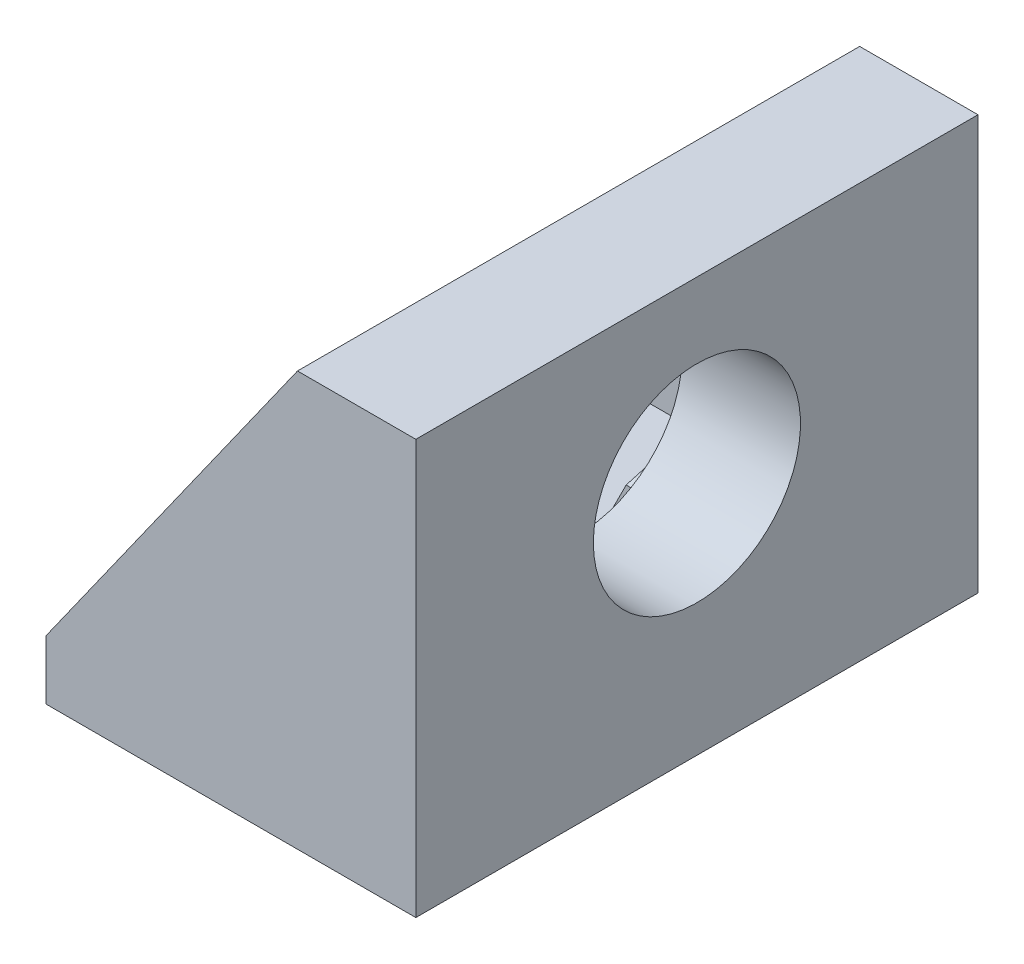
ISO-10303-21;
HEADER;
FILE_DESCRIPTION(('STEP AP214'),'2;1');
FILE_NAME('part.step','',(''),(''),'','','');
FILE_SCHEMA(('AUTOMOTIVE_DESIGN { 1 0 10303 214 1 1 1 1 }'));
ENDSEC;
DATA;
#1=APPLICATION_CONTEXT('core data for automotive mechanical design processes');
#2=APPLICATION_PROTOCOL_DEFINITION('international standard','automotive_design',2000,#1);
#3=PRODUCT_CONTEXT('',#1,'mechanical');
#4=PRODUCT('Part','Part','',(#3));
#5=PRODUCT_RELATED_PRODUCT_CATEGORY('part','',(#4));
#6=PRODUCT_DEFINITION_FORMATION('','',#4);
#7=PRODUCT_DEFINITION_CONTEXT('part definition',#1,'design');
#8=PRODUCT_DEFINITION('design','',#6,#7);
#9=PRODUCT_DEFINITION_SHAPE('','',#8);
#10=(LENGTH_UNIT() NAMED_UNIT(*) SI_UNIT(.MILLI.,.METRE.));
#11=(NAMED_UNIT(*) PLANE_ANGLE_UNIT() SI_UNIT($,.RADIAN.));
#12=(NAMED_UNIT(*) SI_UNIT($,.STERADIAN.) SOLID_ANGLE_UNIT());
#13=UNCERTAINTY_MEASURE_WITH_UNIT(LENGTH_MEASURE(1.E-05),#10,'distance_accuracy_value','');
#14=(GEOMETRIC_REPRESENTATION_CONTEXT(3) GLOBAL_UNCERTAINTY_ASSIGNED_CONTEXT((#13)) GLOBAL_UNIT_ASSIGNED_CONTEXT((#10,
#11,#12)) REPRESENTATION_CONTEXT('',''));
#15=CARTESIAN_POINT('',(0.,0.,0.));
#16=DIRECTION('',(0.,0.,1.));
#17=DIRECTION('',(1.,0.,0.));
#18=AXIS2_PLACEMENT_3D('',#15,#16,#17);
#19=CARTESIAN_POINT('',(2.25,7.,3.5));
#20=DIRECTION('',(-0.894427190999916,0.447213595499958,0.));
#21=DIRECTION('',(-0.447213595499958,-0.894427190999916,0.));
#22=AXIS2_PLACEMENT_3D('',#19,#20,#21);
#23=PLANE('',#22);
#24=DIRECTION('',(0.,0.,1.));
#25=VECTOR('',#24,1.);
#26=CARTESIAN_POINT('',(2.25,7.,3.5));
#27=LINE('',#26,#25);
#28=CARTESIAN_POINT('',(2.25,7.,5.82054765464556));
#29=VERTEX_POINT('',#28);
#30=CARTESIAN_POINT('',(2.25,7.,7.5));
#31=VERTEX_POINT('',#30);
#32=EDGE_CURVE('E239',#29,#31,#27,.T.);
#33=ORIENTED_EDGE('',*,*,#32,.F.);
#34=CARTESIAN_POINT('',(2.7325,7.965,0.));
#35=DIRECTION('',(-0.894427190999916,0.447213595499958,0.));
#36=DIRECTION('',(0.447213595499958,0.894427190999916,0.));
#37=AXIS2_PLACEMENT_3D('',#34,#35,#36);
#38=ELLIPSE('',#37,6.59640053362438,5.9);
#39=CARTESIAN_POINT('',(0.357631582592419,3.21526316518484,3.5));
#40=VERTEX_POINT('',#39);
#41=EDGE_CURVE('E197',#29,#40,#38,.F.);
#42=ORIENTED_EDGE('',*,*,#41,.T.);
#43=DIRECTION('',(-0.447213595499958,-0.894427190999916,0.));
#44=VECTOR('',#43,1.);
#45=CARTESIAN_POINT('',(2.25,7.,3.5));
#46=LINE('',#45,#44);
#47=CARTESIAN_POINT('',(-0.25,2.,3.5));
#48=VERTEX_POINT('',#47);
#49=EDGE_CURVE('E237',#40,#48,#46,.T.);
#50=ORIENTED_EDGE('',*,*,#49,.T.);
#51=DIRECTION('',(0.,0.,1.));
#52=VECTOR('',#51,1.);
#53=CARTESIAN_POINT('',(-0.25,2.,3.5));
#54=LINE('',#53,#52);
#55=CARTESIAN_POINT('',(-0.25,2.,7.5));
#56=VERTEX_POINT('',#55);
#57=EDGE_CURVE('E241',#48,#56,#54,.T.);
#58=ORIENTED_EDGE('',*,*,#57,.T.);
#59=DIRECTION('',(-0.447213595499958,-0.894427190999916,0.));
#60=VECTOR('',#59,1.);
#61=CARTESIAN_POINT('',(2.25,7.,7.5));
#62=LINE('',#61,#60);
#63=EDGE_CURVE('E228',#31,#56,#62,.T.);
#64=ORIENTED_EDGE('',*,*,#63,.F.);
#65=EDGE_LOOP('',(#33,#42,#50,#58,#64));
#66=FACE_BOUND('',#65,.T.);
#67=ADVANCED_FACE('F33',(#66),#23,.T.);
#68=CARTESIAN_POINT('',(0.,0.,3.5));
#69=DIRECTION('',(0.,0.,1.));
#70=DIRECTION('',(1.,0.,0.));
#71=AXIS2_PLACEMENT_3D('',#68,#69,#70);
#72=PLANE('',#71);
#73=DIRECTION('',(1.,0.,0.));
#74=VECTOR('',#73,1.);
#75=CARTESIAN_POINT('',(-0.750000000000001,3.21526316518484,3.5));
#76=LINE('',#75,#74);
#77=CARTESIAN_POINT('',(2.25,3.21526316518484,3.5));
#78=VERTEX_POINT('',#77);
#79=EDGE_CURVE('E195',#78,#40,#76,.F.);
#80=ORIENTED_EDGE('',*,*,#79,.F.);
#81=DIRECTION('',(0.,1.,0.));
#82=VECTOR('',#81,1.);
#83=CARTESIAN_POINT('',(2.25,2.,3.5));
#84=LINE('',#83,#82);
#85=CARTESIAN_POINT('',(2.25,2.,3.5));
#86=VERTEX_POINT('',#85);
#87=EDGE_CURVE('E234',#86,#78,#84,.T.);
#88=ORIENTED_EDGE('',*,*,#87,.F.);
#89=DIRECTION('',(1.,0.,0.));
#90=VECTOR('',#89,1.);
#91=CARTESIAN_POINT('',(-0.25,2.,3.5));
#92=LINE('',#91,#90);
#93=EDGE_CURVE('E231',#48,#86,#92,.T.);
#94=ORIENTED_EDGE('',*,*,#93,.F.);
#95=ORIENTED_EDGE('',*,*,#49,.F.);
#96=EDGE_LOOP('',(#80,#88,#94,#95));
#97=FACE_BOUND('',#96,.T.);
#98=ADVANCED_FACE('F315',(#97),#72,.F.);
#99=CARTESIAN_POINT('',(2.25,7.,-3.5));
#100=DIRECTION('',(0.894427190999916,-0.447213595499958,0.));
#101=DIRECTION('',(0.447213595499958,0.894427190999916,0.));
#102=AXIS2_PLACEMENT_3D('',#99,#100,#101);
#103=PLANE('',#102);
#104=CARTESIAN_POINT('',(2.7325,7.965,0.));
#105=DIRECTION('',(0.894427190999916,-0.447213595499958,0.));
#106=DIRECTION('',(0.447213595499958,0.894427190999916,0.));
#107=AXIS2_PLACEMENT_3D('',#104,#105,#106);
#108=ELLIPSE('',#107,6.59640053362438,5.9);
#109=CARTESIAN_POINT('',(2.25,7.,-5.82054765464556));
#110=VERTEX_POINT('',#109);
#111=CARTESIAN_POINT('',(0.357631582592419,3.21526316518484,-3.5));
#112=VERTEX_POINT('',#111);
#113=EDGE_CURVE('E193',#110,#112,#108,.F.);
#114=ORIENTED_EDGE('',*,*,#113,.F.);
#115=DIRECTION('',(0.,0.,-1.));
#116=VECTOR('',#115,1.);
#117=CARTESIAN_POINT('',(2.25,7.,-3.5));
#118=LINE('',#117,#116);
#119=CARTESIAN_POINT('',(2.25,7.,-7.5));
#120=VERTEX_POINT('',#119);
#121=EDGE_CURVE('E210',#110,#120,#118,.T.);
#122=ORIENTED_EDGE('',*,*,#121,.T.);
#123=DIRECTION('',(-0.447213595499958,-0.894427190999916,0.));
#124=VECTOR('',#123,1.);
#125=CARTESIAN_POINT('',(2.25,7.,-7.5));
#126=LINE('',#125,#124);
#127=CARTESIAN_POINT('',(-0.25,2.,-7.5));
#128=VERTEX_POINT('',#127);
#129=EDGE_CURVE('E200',#120,#128,#126,.T.);
#130=ORIENTED_EDGE('',*,*,#129,.T.);
#131=DIRECTION('',(0.,0.,-1.));
#132=VECTOR('',#131,1.);
#133=CARTESIAN_POINT('',(-0.25,2.,-3.5));
#134=LINE('',#133,#132);
#135=CARTESIAN_POINT('',(-0.25,2.,-3.5));
#136=VERTEX_POINT('',#135);
#137=EDGE_CURVE('E207',#136,#128,#134,.T.);
#138=ORIENTED_EDGE('',*,*,#137,.F.);
#139=DIRECTION('',(-0.447213595499958,-0.894427190999916,0.));
#140=VECTOR('',#139,1.);
#141=CARTESIAN_POINT('',(2.25,7.,-3.5));
#142=LINE('',#141,#140);
#143=EDGE_CURVE('E55',#112,#136,#142,.T.);
#144=ORIENTED_EDGE('',*,*,#143,.F.);
#145=EDGE_LOOP('',(#114,#122,#130,#138,#144));
#146=FACE_BOUND('',#145,.T.);
#147=ADVANCED_FACE('F306',(#146),#103,.F.);
#148=CARTESIAN_POINT('',(0.,0.,-3.5));
#149=DIRECTION('',(0.,0.,-1.));
#150=DIRECTION('',(1.,0.,0.));
#151=AXIS2_PLACEMENT_3D('',#148,#149,#150);
#152=PLANE('',#151);
#153=DIRECTION('',(1.,0.,0.));
#154=VECTOR('',#153,1.);
#155=CARTESIAN_POINT('',(-0.750000000000001,3.21526316518484,-3.5));
#156=LINE('',#155,#154);
#157=CARTESIAN_POINT('',(2.25,3.21526316518484,-3.5));
#158=VERTEX_POINT('',#157);
#159=EDGE_CURVE('E11',#112,#158,#156,.T.);
#160=ORIENTED_EDGE('',*,*,#159,.F.);
#161=ORIENTED_EDGE('',*,*,#143,.T.);
#162=DIRECTION('',(1.,0.,0.));
#163=VECTOR('',#162,1.);
#164=CARTESIAN_POINT('',(-0.25,2.,-3.5));
#165=LINE('',#164,#163);
#166=CARTESIAN_POINT('',(2.25,2.,-3.5));
#167=VERTEX_POINT('',#166);
#168=EDGE_CURVE('E201',#136,#167,#165,.T.);
#169=ORIENTED_EDGE('',*,*,#168,.T.);
#170=DIRECTION('',(0.,1.,0.));
#171=VECTOR('',#170,1.);
#172=CARTESIAN_POINT('',(2.25,2.,-3.5));
#173=LINE('',#172,#171);
#174=EDGE_CURVE('E204',#167,#158,#173,.T.);
#175=ORIENTED_EDGE('',*,*,#174,.T.);
#176=EDGE_LOOP('',(#160,#161,#169,#175));
#177=FACE_BOUND('',#176,.T.);
#178=ADVANCED_FACE('F309',(#177),#152,.F.);
#179=CARTESIAN_POINT('',(0.,2.,0.));
#180=DIRECTION('',(0.,-1.,0.));
#181=DIRECTION('',(0.,0.,-1.));
#182=AXIS2_PLACEMENT_3D('',#179,#180,#181);
#183=PLANE('',#182);
#184=CARTESIAN_POINT('',(-2.25,2.,0.));
#185=DIRECTION('',(0.,1.,0.));
#186=DIRECTION('',(0.,0.,1.));
#187=AXIS2_PLACEMENT_3D('',#184,#185,#186);
#188=CIRCLE('',#187,3.5433);
#189=CARTESIAN_POINT('',(-2.25,2.,3.5433));
#190=VERTEX_POINT('',#189);
#191=EDGE_CURVE('E213',#190,#190,#188,.T.);
#192=ORIENTED_EDGE('',*,*,#191,.F.);
#193=EDGE_LOOP('',(#192));
#194=FACE_BOUND('',#193,.T.);
#195=ORIENTED_EDGE('',*,*,#137,.T.);
#196=DIRECTION('',(-1.,0.,0.));
#197=VECTOR('',#196,1.);
#198=CARTESIAN_POINT('',(-6.25,2.,-7.5));
#199=LINE('',#198,#197);
#200=CARTESIAN_POINT('',(-6.25,2.,-7.5));
#201=VERTEX_POINT('',#200);
#202=EDGE_CURVE('E41',#128,#201,#199,.T.);
#203=ORIENTED_EDGE('',*,*,#202,.T.);
#204=DIRECTION('',(0.,0.,1.));
#205=VECTOR('',#204,1.);
#206=CARTESIAN_POINT('',(-6.25,2.,7.5));
#207=LINE('',#206,#205);
#208=CARTESIAN_POINT('',(-6.25,2.,7.5));
#209=VERTEX_POINT('',#208);
#210=EDGE_CURVE('E141',#201,#209,#207,.T.);
#211=ORIENTED_EDGE('',*,*,#210,.T.);
#212=DIRECTION('',(1.,0.,0.));
#213=VECTOR('',#212,1.);
#214=CARTESIAN_POINT('',(-6.25,2.,7.5));
#215=LINE('',#214,#213);
#216=EDGE_CURVE('E262',#209,#56,#215,.T.);
#217=ORIENTED_EDGE('',*,*,#216,.T.);
#218=ORIENTED_EDGE('',*,*,#57,.F.);
#219=ORIENTED_EDGE('',*,*,#93,.T.);
#220=DIRECTION('',(0.,0.,1.));
#221=VECTOR('',#220,1.);
#222=CARTESIAN_POINT('',(2.25,2.,-7.5));
#223=LINE('',#222,#221);
#224=EDGE_CURVE('E244',#167,#86,#223,.T.);
#225=ORIENTED_EDGE('',*,*,#224,.F.);
#226=ORIENTED_EDGE('',*,*,#168,.F.);
#227=EDGE_LOOP('',(#195,#203,#211,#217,#218,#219,#225,#226));
#228=FACE_BOUND('',#227,.T.);
#229=ADVANCED_FACE('F300',(#194,#228),#183,.F.);
#230=CARTESIAN_POINT('',(2.25,14.,-7.5));
#231=DIRECTION('',(1.,0.,0.));
#232=DIRECTION('',(0.,0.,-1.));
#233=AXIS2_PLACEMENT_3D('',#230,#231,#232);
#234=PLANE('',#233);
#235=CARTESIAN_POINT('',(2.25,7.965,0.));
#236=DIRECTION('',(-1.,0.,0.));
#237=DIRECTION('',(0.,0.,1.));
#238=AXIS2_PLACEMENT_3D('',#235,#236,#237);
#239=CIRCLE('',#238,5.9);
#240=EDGE_CURVE('E191',#78,#29,#239,.T.);
#241=ORIENTED_EDGE('',*,*,#240,.T.);
#242=ORIENTED_EDGE('',*,*,#32,.T.);
#243=DIRECTION('',(0.,-1.,0.));
#244=VECTOR('',#243,1.);
#245=CARTESIAN_POINT('',(2.25,14.,7.5));
#246=LINE('',#245,#244);
#247=CARTESIAN_POINT('',(2.25,14.,7.5));
#248=VERTEX_POINT('',#247);
#249=EDGE_CURVE('E252',#248,#31,#246,.T.);
#250=ORIENTED_EDGE('',*,*,#249,.F.);
#251=DIRECTION('',(0.,0.,1.));
#252=VECTOR('',#251,1.);
#253=CARTESIAN_POINT('',(2.25,14.,-7.5));
#254=LINE('',#253,#252);
#255=CARTESIAN_POINT('',(2.25,14.,-7.5));
#256=VERTEX_POINT('',#255);
#257=EDGE_CURVE('E247',#256,#248,#254,.T.);
#258=ORIENTED_EDGE('',*,*,#257,.F.);
#259=DIRECTION('',(0.,-1.,0.));
#260=VECTOR('',#259,1.);
#261=CARTESIAN_POINT('',(2.25,14.,-7.5));
#262=LINE('',#261,#260);
#263=EDGE_CURVE('E269',#256,#120,#262,.T.);
#264=ORIENTED_EDGE('',*,*,#263,.T.);
#265=ORIENTED_EDGE('',*,*,#121,.F.);
#266=EDGE_CURVE('E48',#110,#158,#239,.T.);
#267=ORIENTED_EDGE('',*,*,#266,.T.);
#268=ORIENTED_EDGE('',*,*,#174,.F.);
#269=ORIENTED_EDGE('',*,*,#224,.T.);
#270=ORIENTED_EDGE('',*,*,#87,.T.);
#271=EDGE_LOOP('',(#241,#242,#250,#258,#264,#265,#267,#268,#269,#270));
#272=FACE_BOUND('',#271,.T.);
#273=CARTESIAN_POINT('',(2.25,7.965,0.));
#274=DIRECTION('',(-1.,0.,0.));
#275=DIRECTION('',(0.,0.,1.));
#276=AXIS2_PLACEMENT_3D('',#273,#274,#275);
#277=CIRCLE('',#276,3.5);
#278=CARTESIAN_POINT('',(2.25,7.965,3.5));
#279=VERTEX_POINT('',#278);
#280=EDGE_CURVE('E224',#279,#279,#277,.T.);
#281=ORIENTED_EDGE('',*,*,#280,.F.);
#282=EDGE_LOOP('',(#281));
#283=FACE_BOUND('',#282,.T.);
#284=ADVANCED_FACE('F278',(#272,#283),#234,.F.);
#285=CARTESIAN_POINT('',(-6.25,2.,7.5));
#286=DIRECTION('',(1.,0.,0.));
#287=DIRECTION('',(0.,0.,-1.));
#288=AXIS2_PLACEMENT_3D('',#285,#286,#287);
#289=PLANE('',#288);
#290=DIRECTION('',(0.,0.,1.));
#291=VECTOR('',#290,1.);
#292=CARTESIAN_POINT('',(-6.25,0.,7.5));
#293=LINE('',#292,#291);
#294=CARTESIAN_POINT('',(-6.25,0.,-9.5));
#295=VERTEX_POINT('',#294);
#296=CARTESIAN_POINT('',(-6.25,0.,9.5));
#297=VERTEX_POINT('',#296);
#298=EDGE_CURVE('E266',#295,#297,#293,.T.);
#299=ORIENTED_EDGE('',*,*,#298,.T.);
#300=DIRECTION('',(0.,-1.,0.));
#301=VECTOR('',#300,1.);
#302=CARTESIAN_POINT('',(-6.25,2.,9.5));
#303=LINE('',#302,#301);
#304=CARTESIAN_POINT('',(-6.25,2.,9.5));
#305=VERTEX_POINT('',#304);
#306=EDGE_CURVE('E172',#305,#297,#303,.T.);
#307=ORIENTED_EDGE('',*,*,#306,.F.);
#308=DIRECTION('',(0.,0.,-1.));
#309=VECTOR('',#308,1.);
#310=CARTESIAN_POINT('',(-6.25,2.,9.5));
#311=LINE('',#310,#309);
#312=EDGE_CURVE('E185',#305,#209,#311,.T.);
#313=ORIENTED_EDGE('',*,*,#312,.T.);
#314=ORIENTED_EDGE('',*,*,#210,.F.);
#315=DIRECTION('',(0.,0.,1.));
#316=VECTOR('',#315,1.);
#317=CARTESIAN_POINT('',(-6.25,2.,-9.5));
#318=LINE('',#317,#316);
#319=CARTESIAN_POINT('',(-6.25,2.,-9.5));
#320=VERTEX_POINT('',#319);
#321=EDGE_CURVE('E135',#320,#201,#318,.T.);
#322=ORIENTED_EDGE('',*,*,#321,.F.);
#323=DIRECTION('',(0.,-1.,0.));
#324=VECTOR('',#323,1.);
#325=CARTESIAN_POINT('',(-6.25,2.,-9.5));
#326=LINE('',#325,#324);
#327=EDGE_CURVE('E137',#320,#295,#326,.T.);
#328=ORIENTED_EDGE('',*,*,#327,.T.);
#329=EDGE_LOOP('',(#299,#307,#313,#314,#322,#328));
#330=FACE_BOUND('',#329,.T.);
#331=ADVANCED_FACE('F35',(#330),#289,.F.);
#332=CARTESIAN_POINT('',(6.25,2.,7.5));
#333=DIRECTION('',(-1.,0.,0.));
#334=DIRECTION('',(0.,0.,1.));
#335=AXIS2_PLACEMENT_3D('',#332,#333,#334);
#336=PLANE('',#335);
#337=CARTESIAN_POINT('',(6.25,7.965,0.));
#338=DIRECTION('',(-1.,0.,0.));
#339=DIRECTION('',(0.,0.,1.));
#340=AXIS2_PLACEMENT_3D('',#337,#338,#339);
#341=CIRCLE('',#340,3.5);
#342=CARTESIAN_POINT('',(6.25,7.965,3.5));
#343=VERTEX_POINT('',#342);
#344=EDGE_CURVE('E225',#343,#343,#341,.T.);
#345=ORIENTED_EDGE('',*,*,#344,.T.);
#346=EDGE_LOOP('',(#345));
#347=FACE_BOUND('',#346,.T.);
#348=DIRECTION('',(0.,0.,-1.));
#349=VECTOR('',#348,1.);
#350=CARTESIAN_POINT('',(6.25,0.,7.5));
#351=LINE('',#350,#349);
#352=CARTESIAN_POINT('',(6.25,0.,9.5));
#353=VERTEX_POINT('',#352);
#354=CARTESIAN_POINT('',(6.25,0.,-9.5));
#355=VERTEX_POINT('',#354);
#356=EDGE_CURVE('E268',#353,#355,#351,.T.);
#357=ORIENTED_EDGE('',*,*,#356,.T.);
#358=DIRECTION('',(0.,1.,0.));
#359=VECTOR('',#358,1.);
#360=CARTESIAN_POINT('',(6.25,0.,-9.5));
#361=LINE('',#360,#359);
#362=CARTESIAN_POINT('',(6.25,14.,-9.5));
#363=VERTEX_POINT('',#362);
#364=EDGE_CURVE('E164',#355,#363,#361,.T.);
#365=ORIENTED_EDGE('',*,*,#364,.T.);
#366=DIRECTION('',(0.,0.,-1.));
#367=VECTOR('',#366,1.);
#368=CARTESIAN_POINT('',(6.25,14.,-7.5));
#369=LINE('',#368,#367);
#370=CARTESIAN_POINT('',(6.25,14.,9.5));
#371=VERTEX_POINT('',#370);
#372=EDGE_CURVE('E250',#371,#363,#369,.T.);
#373=ORIENTED_EDGE('',*,*,#372,.F.);
#374=DIRECTION('',(0.,1.,0.));
#375=VECTOR('',#374,1.);
#376=CARTESIAN_POINT('',(6.25,0.,9.5));
#377=LINE('',#376,#375);
#378=EDGE_CURVE('E178',#353,#371,#377,.T.);
#379=ORIENTED_EDGE('',*,*,#378,.F.);
#380=EDGE_LOOP('',(#357,#365,#373,#379));
#381=FACE_BOUND('',#380,.T.);
#382=ADVANCED_FACE('F288',(#347,#381),#336,.F.);
#383=CARTESIAN_POINT('',(0.,0.,0.));
#384=DIRECTION('',(0.,-1.,0.));
#385=DIRECTION('',(0.,0.,-1.));
#386=AXIS2_PLACEMENT_3D('',#383,#384,#385);
#387=PLANE('',#386);
#388=CARTESIAN_POINT('',(-2.25,0.,0.));
#389=DIRECTION('',(0.,1.,0.));
#390=DIRECTION('',(0.,0.,1.));
#391=AXIS2_PLACEMENT_3D('',#388,#389,#390);
#392=CIRCLE('',#391,2.15265);
#393=CARTESIAN_POINT('',(-2.25,0.,2.15265));
#394=VERTEX_POINT('',#393);
#395=EDGE_CURVE('E221',#394,#394,#392,.T.);
#396=ORIENTED_EDGE('',*,*,#395,.T.);
#397=EDGE_LOOP('',(#396));
#398=FACE_BOUND('',#397,.T.);
#399=ORIENTED_EDGE('',*,*,#298,.F.);
#400=DIRECTION('',(1.,0.,0.));
#401=VECTOR('',#400,1.);
#402=CARTESIAN_POINT('',(-6.25,0.,-9.5));
#403=LINE('',#402,#401);
#404=EDGE_CURVE('E157',#295,#355,#403,.T.);
#405=ORIENTED_EDGE('',*,*,#404,.T.);
#406=ORIENTED_EDGE('',*,*,#356,.F.);
#407=DIRECTION('',(1.,0.,0.));
#408=VECTOR('',#407,1.);
#409=CARTESIAN_POINT('',(-6.25,0.,9.5));
#410=LINE('',#409,#408);
#411=EDGE_CURVE('E175',#297,#353,#410,.T.);
#412=ORIENTED_EDGE('',*,*,#411,.F.);
#413=EDGE_LOOP('',(#399,#405,#406,#412));
#414=FACE_BOUND('',#413,.T.);
#415=ADVANCED_FACE('F292',(#398,#414),#387,.T.);
#416=CARTESIAN_POINT('',(0.,14.,0.));
#417=DIRECTION('',(0.,1.,0.));
#418=DIRECTION('',(0.,0.,1.));
#419=AXIS2_PLACEMENT_3D('',#416,#417,#418);
#420=PLANE('',#419);
#421=ORIENTED_EDGE('',*,*,#372,.T.);
#422=DIRECTION('',(-1.,0.,0.));
#423=VECTOR('',#422,1.);
#424=CARTESIAN_POINT('',(6.25,14.,-9.5));
#425=LINE('',#424,#423);
#426=CARTESIAN_POINT('',(2.25,14.,-9.5));
#427=VERTEX_POINT('',#426);
#428=EDGE_CURVE('E162',#363,#427,#425,.T.);
#429=ORIENTED_EDGE('',*,*,#428,.T.);
#430=DIRECTION('',(0.,0.,1.));
#431=VECTOR('',#430,1.);
#432=CARTESIAN_POINT('',(2.25,14.,-9.5));
#433=LINE('',#432,#431);
#434=EDGE_CURVE('E147',#427,#256,#433,.T.);
#435=ORIENTED_EDGE('',*,*,#434,.T.);
#436=ORIENTED_EDGE('',*,*,#257,.T.);
#437=DIRECTION('',(0.,0.,-1.));
#438=VECTOR('',#437,1.);
#439=CARTESIAN_POINT('',(2.25,14.,9.5));
#440=LINE('',#439,#438);
#441=CARTESIAN_POINT('',(2.25,14.,9.5));
#442=VERTEX_POINT('',#441);
#443=EDGE_CURVE('E189',#442,#248,#440,.T.);
#444=ORIENTED_EDGE('',*,*,#443,.F.);
#445=DIRECTION('',(-1.,0.,0.));
#446=VECTOR('',#445,1.);
#447=CARTESIAN_POINT('',(6.25,14.,9.5));
#448=LINE('',#447,#446);
#449=EDGE_CURVE('E181',#371,#442,#448,.T.);
#450=ORIENTED_EDGE('',*,*,#449,.F.);
#451=EDGE_LOOP('',(#421,#429,#435,#436,#444,#450));
#452=FACE_BOUND('',#451,.T.);
#453=ADVANCED_FACE('F284',(#452),#420,.T.);
#454=CARTESIAN_POINT('',(6.25,7.965,0.));
#455=DIRECTION('',(-1.,0.,0.));
#456=DIRECTION('',(0.,0.,1.));
#457=AXIS2_PLACEMENT_3D('',#454,#455,#456);
#458=CYLINDRICAL_SURFACE('',#457,3.5);
#459=ORIENTED_EDGE('',*,*,#344,.F.);
#460=EDGE_LOOP('',(#459));
#461=FACE_BOUND('',#460,.T.);
#462=ORIENTED_EDGE('',*,*,#280,.T.);
#463=EDGE_LOOP('',(#462));
#464=FACE_BOUND('',#463,.T.);
#465=ADVANCED_FACE('F344',(#461,#464),#458,.F.);
#466=CARTESIAN_POINT('',(-2.25,2.,0.));
#467=DIRECTION('',(0.,1.,0.));
#468=DIRECTION('',(0.,0.,1.));
#469=AXIS2_PLACEMENT_3D('',#466,#467,#468);
#470=CYLINDRICAL_SURFACE('',#469,2.15265);
#471=ORIENTED_EDGE('',*,*,#395,.F.);
#472=EDGE_LOOP('',(#471));
#473=FACE_BOUND('',#472,.T.);
#474=CARTESIAN_POINT('',(-2.25,0.833106097903315,0.));
#475=DIRECTION('',(0.,1.,0.));
#476=DIRECTION('',(0.,0.,1.));
#477=AXIS2_PLACEMENT_3D('',#474,#475,#476);
#478=CIRCLE('',#477,2.15265);
#479=CARTESIAN_POINT('',(-2.25,0.833106097903315,2.15265));
#480=VERTEX_POINT('',#479);
#481=EDGE_CURVE('E218',#480,#480,#478,.T.);
#482=ORIENTED_EDGE('',*,*,#481,.T.);
#483=EDGE_LOOP('',(#482));
#484=FACE_BOUND('',#483,.T.);
#485=ADVANCED_FACE('F361',(#473,#484),#470,.F.);
#486=CARTESIAN_POINT('',(-2.25,2.,0.));
#487=DIRECTION('',(0.,1.,0.));
#488=DIRECTION('',(0.,0.,1.));
#489=AXIS2_PLACEMENT_3D('',#486,#487,#488);
#490=CONICAL_SURFACE('',#489,3.5433,0.872664625997165);
#491=ORIENTED_EDGE('',*,*,#481,.F.);
#492=EDGE_LOOP('',(#491));
#493=FACE_BOUND('',#492,.T.);
#494=ORIENTED_EDGE('',*,*,#191,.T.);
#495=EDGE_LOOP('',(#494));
#496=FACE_BOUND('',#495,.T.);
#497=ADVANCED_FACE('F366',(#493,#496),#490,.F.);
#498=CARTESIAN_POINT('',(-0.750000000000001,7.965,0.));
#499=DIRECTION('',(1.,0.,0.));
#500=DIRECTION('',(0.,0.,-1.));
#501=AXIS2_PLACEMENT_3D('',#498,#499,#500);
#502=CYLINDRICAL_SURFACE('',#501,5.9);
#503=ORIENTED_EDGE('',*,*,#113,.T.);
#504=ORIENTED_EDGE('',*,*,#159,.T.);
#505=ORIENTED_EDGE('',*,*,#266,.F.);
#506=EDGE_LOOP('',(#503,#504,#505));
#507=FACE_BOUND('',#506,.T.);
#508=ADVANCED_FACE('F308',(#507),#502,.F.);
#509=ORIENTED_EDGE('',*,*,#240,.F.);
#510=ORIENTED_EDGE('',*,*,#79,.T.);
#511=ORIENTED_EDGE('',*,*,#41,.F.);
#512=EDGE_LOOP('',(#509,#510,#511));
#513=FACE_BOUND('',#512,.T.);
#514=ADVANCED_FACE('F331',(#513),#502,.F.);
#515=CARTESIAN_POINT('',(0.,0.,7.5));
#516=DIRECTION('',(0.,0.,1.));
#517=DIRECTION('',(1.,0.,0.));
#518=AXIS2_PLACEMENT_3D('',#515,#516,#517);
#519=PLANE('',#518);
#520=DIRECTION('',(-0.578017340780339,-0.816024481101655,0.));
#521=VECTOR('',#520,1.);
#522=CARTESIAN_POINT('',(2.25,14.,7.5));
#523=LINE('',#522,#521);
#524=EDGE_CURVE('E146',#248,#209,#523,.T.);
#525=ORIENTED_EDGE('',*,*,#524,.F.);
#526=ORIENTED_EDGE('',*,*,#249,.T.);
#527=ORIENTED_EDGE('',*,*,#63,.T.);
#528=ORIENTED_EDGE('',*,*,#216,.F.);
#529=EDGE_LOOP('',(#525,#526,#527,#528));
#530=FACE_BOUND('',#529,.T.);
#531=ADVANCED_FACE('F322',(#530),#519,.F.);
#532=CARTESIAN_POINT('',(2.25,14.,9.5));
#533=DIRECTION('',(0.816024481101655,-0.578017340780339,0.));
#534=DIRECTION('',(0.578017340780339,0.816024481101655,0.));
#535=AXIS2_PLACEMENT_3D('',#532,#533,#534);
#536=PLANE('',#535);
#537=ORIENTED_EDGE('',*,*,#524,.T.);
#538=ORIENTED_EDGE('',*,*,#312,.F.);
#539=DIRECTION('',(-0.578017340780339,-0.816024481101655,0.));
#540=VECTOR('',#539,1.);
#541=CARTESIAN_POINT('',(2.25,14.,9.5));
#542=LINE('',#541,#540);
#543=EDGE_CURVE('E183',#442,#305,#542,.T.);
#544=ORIENTED_EDGE('',*,*,#543,.F.);
#545=ORIENTED_EDGE('',*,*,#443,.T.);
#546=EDGE_LOOP('',(#537,#538,#544,#545));
#547=FACE_BOUND('',#546,.T.);
#548=ADVANCED_FACE('F323',(#547),#536,.F.);
#549=CARTESIAN_POINT('',(0.,0.,9.5));
#550=DIRECTION('',(0.,0.,1.));
#551=DIRECTION('',(1.,0.,0.));
#552=AXIS2_PLACEMENT_3D('',#549,#550,#551);
#553=PLANE('',#552);
#554=ORIENTED_EDGE('',*,*,#306,.T.);
#555=ORIENTED_EDGE('',*,*,#411,.T.);
#556=ORIENTED_EDGE('',*,*,#378,.T.);
#557=ORIENTED_EDGE('',*,*,#449,.T.);
#558=ORIENTED_EDGE('',*,*,#543,.T.);
#559=EDGE_LOOP('',(#554,#555,#556,#557,#558));
#560=FACE_BOUND('',#559,.T.);
#561=ADVANCED_FACE('F294',(#560),#553,.T.);
#562=CARTESIAN_POINT('',(2.25,14.,-9.5));
#563=DIRECTION('',(-0.816024481101655,0.578017340780339,0.));
#564=DIRECTION('',(-0.578017340780339,-0.816024481101655,0.));
#565=AXIS2_PLACEMENT_3D('',#562,#563,#564);
#566=PLANE('',#565);
#567=DIRECTION('',(-0.578017340780339,-0.816024481101655,0.));
#568=VECTOR('',#567,1.);
#569=CARTESIAN_POINT('',(2.25,14.,-7.5));
#570=LINE('',#569,#568);
#571=EDGE_CURVE('E158',#256,#201,#570,.T.);
#572=ORIENTED_EDGE('',*,*,#571,.F.);
#573=ORIENTED_EDGE('',*,*,#434,.F.);
#574=DIRECTION('',(-0.578017340780339,-0.816024481101655,0.));
#575=VECTOR('',#574,1.);
#576=CARTESIAN_POINT('',(2.25,14.,-9.5));
#577=LINE('',#576,#575);
#578=EDGE_CURVE('E153',#427,#320,#577,.T.);
#579=ORIENTED_EDGE('',*,*,#578,.T.);
#580=ORIENTED_EDGE('',*,*,#321,.T.);
#581=EDGE_LOOP('',(#572,#573,#579,#580));
#582=FACE_BOUND('',#581,.T.);
#583=ADVANCED_FACE('F160',(#582),#566,.T.);
#584=CARTESIAN_POINT('',(0.,0.,-9.5));
#585=DIRECTION('',(0.,0.,-1.));
#586=DIRECTION('',(1.,0.,0.));
#587=AXIS2_PLACEMENT_3D('',#584,#585,#586);
#588=PLANE('',#587);
#589=ORIENTED_EDGE('',*,*,#327,.F.);
#590=ORIENTED_EDGE('',*,*,#578,.F.);
#591=ORIENTED_EDGE('',*,*,#428,.F.);
#592=ORIENTED_EDGE('',*,*,#364,.F.);
#593=ORIENTED_EDGE('',*,*,#404,.F.);
#594=EDGE_LOOP('',(#589,#590,#591,#592,#593));
#595=FACE_BOUND('',#594,.T.);
#596=ADVANCED_FACE('F151',(#595),#588,.T.);
#597=CARTESIAN_POINT('',(0.,0.,-7.5));
#598=DIRECTION('',(0.,0.,-1.));
#599=DIRECTION('',(1.,0.,0.));
#600=AXIS2_PLACEMENT_3D('',#597,#598,#599);
#601=PLANE('',#600);
#602=ORIENTED_EDGE('',*,*,#202,.F.);
#603=ORIENTED_EDGE('',*,*,#129,.F.);
#604=ORIENTED_EDGE('',*,*,#263,.F.);
#605=ORIENTED_EDGE('',*,*,#571,.T.);
#606=EDGE_LOOP('',(#602,#603,#604,#605));
#607=FACE_BOUND('',#606,.T.);
#608=ADVANCED_FACE('F282',(#607),#601,.F.);
#609=CLOSED_SHELL('',(#67,#98,#147,#178,#229,#284,#331,#382,#415,#453,#465,#485,#497,#508,#514,
#531,#548,#561,#583,#596,#608));
#610=MANIFOLD_SOLID_BREP('B2',#609);
#611=ADVANCED_BREP_SHAPE_REPRESENTATION('',(#18,#610),#14);
#612=SHAPE_DEFINITION_REPRESENTATION(#9,#611);
ENDSEC;
END-ISO-10303-21;
